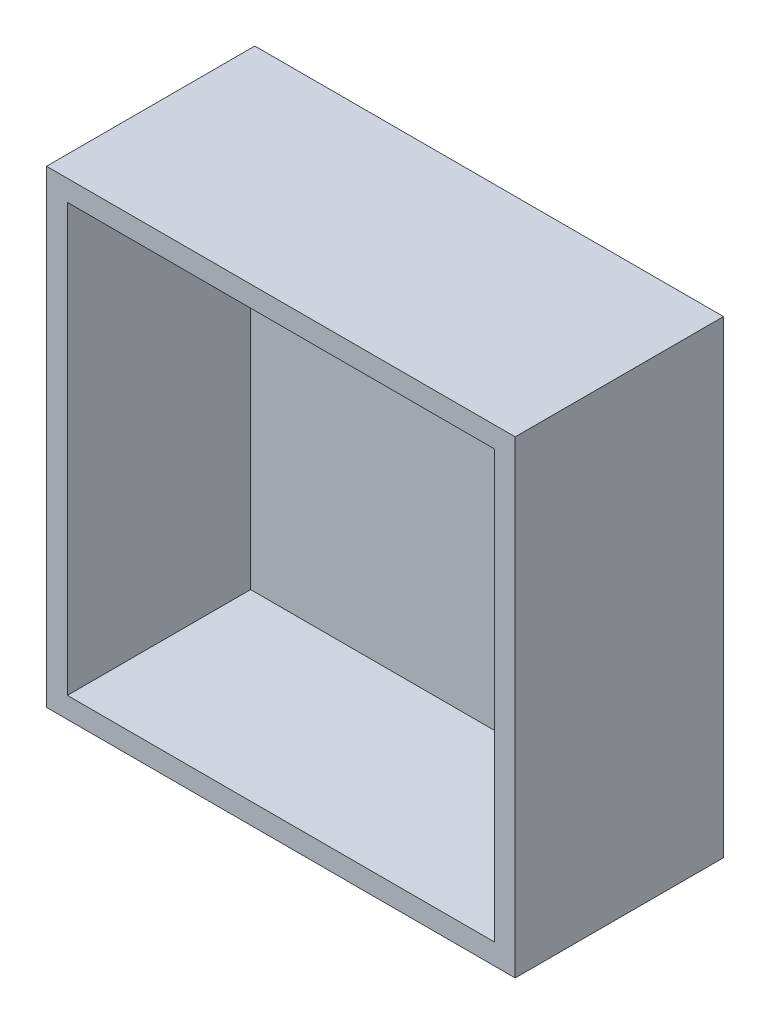
ISO-10303-21;
HEADER;
FILE_DESCRIPTION(('STEP AP214'),'2;1');
FILE_NAME('part.step','',(''),(''),'','','');
FILE_SCHEMA(('AUTOMOTIVE_DESIGN { 1 0 10303 214 1 1 1 1 }'));
ENDSEC;
DATA;
#1=APPLICATION_CONTEXT('core data for automotive mechanical design processes');
#2=APPLICATION_PROTOCOL_DEFINITION('international standard','automotive_design',2000,#1);
#3=PRODUCT_CONTEXT('',#1,'mechanical');
#4=PRODUCT('Part','Part','',(#3));
#5=PRODUCT_RELATED_PRODUCT_CATEGORY('part','',(#4));
#6=PRODUCT_DEFINITION_FORMATION('','',#4);
#7=PRODUCT_DEFINITION_CONTEXT('part definition',#1,'design');
#8=PRODUCT_DEFINITION('design','',#6,#7);
#9=PRODUCT_DEFINITION_SHAPE('','',#8);
#10=(LENGTH_UNIT() NAMED_UNIT(*) SI_UNIT(.MILLI.,.METRE.));
#11=(NAMED_UNIT(*) PLANE_ANGLE_UNIT() SI_UNIT($,.RADIAN.));
#12=(NAMED_UNIT(*) SI_UNIT($,.STERADIAN.) SOLID_ANGLE_UNIT());
#13=UNCERTAINTY_MEASURE_WITH_UNIT(LENGTH_MEASURE(1.E-05),#10,'distance_accuracy_value','');
#14=(GEOMETRIC_REPRESENTATION_CONTEXT(3) GLOBAL_UNCERTAINTY_ASSIGNED_CONTEXT((#13)) GLOBAL_UNIT_ASSIGNED_CONTEXT((#10,
#11,#12)) REPRESENTATION_CONTEXT('',''));
#15=CARTESIAN_POINT('',(0.,0.,0.));
#16=DIRECTION('',(0.,0.,1.));
#17=DIRECTION('',(1.,0.,0.));
#18=AXIS2_PLACEMENT_3D('',#15,#16,#17);
#19=CARTESIAN_POINT('',(22.5,22.5,20.));
#20=DIRECTION('',(-1.,0.,0.));
#21=DIRECTION('',(0.,-1.,0.));
#22=AXIS2_PLACEMENT_3D('',#19,#20,#21);
#23=PLANE('',#22);
#24=DIRECTION('',(0.,1.,0.));
#25=VECTOR('',#24,1.);
#26=CARTESIAN_POINT('',(22.5,22.5,0.));
#27=LINE('',#26,#25);
#28=CARTESIAN_POINT('',(22.5,-22.5,0.));
#29=VERTEX_POINT('',#28);
#30=CARTESIAN_POINT('',(22.5,22.5,0.));
#31=VERTEX_POINT('',#30);
#32=EDGE_CURVE('E139',#29,#31,#27,.T.);
#33=ORIENTED_EDGE('',*,*,#32,.T.);
#34=DIRECTION('',(0.,0.,-1.));
#35=VECTOR('',#34,1.);
#36=CARTESIAN_POINT('',(22.5,22.5,20.));
#37=LINE('',#36,#35);
#38=CARTESIAN_POINT('',(22.5,22.5,20.));
#39=VERTEX_POINT('',#38);
#40=EDGE_CURVE('E11',#39,#31,#37,.T.);
#41=ORIENTED_EDGE('',*,*,#40,.F.);
#42=DIRECTION('',(0.,1.,0.));
#43=VECTOR('',#42,1.);
#44=CARTESIAN_POINT('',(22.5,22.5,20.));
#45=LINE('',#44,#43);
#46=CARTESIAN_POINT('',(22.5,-22.5,20.));
#47=VERTEX_POINT('',#46);
#48=EDGE_CURVE('E150',#47,#39,#45,.T.);
#49=ORIENTED_EDGE('',*,*,#48,.F.);
#50=DIRECTION('',(0.,0.,-1.));
#51=VECTOR('',#50,1.);
#52=CARTESIAN_POINT('',(22.5,-22.5,20.));
#53=LINE('',#52,#51);
#54=EDGE_CURVE('E156',#47,#29,#53,.T.);
#55=ORIENTED_EDGE('',*,*,#54,.T.);
#56=EDGE_LOOP('',(#33,#41,#49,#55));
#57=FACE_BOUND('',#56,.T.);
#58=ADVANCED_FACE('F37',(#57),#23,.F.);
#59=CARTESIAN_POINT('',(-22.5,22.5,20.));
#60=DIRECTION('',(0.,-1.,0.));
#61=DIRECTION('',(0.,0.,-1.));
#62=AXIS2_PLACEMENT_3D('',#59,#60,#61);
#63=PLANE('',#62);
#64=DIRECTION('',(-1.,0.,0.));
#65=VECTOR('',#64,1.);
#66=CARTESIAN_POINT('',(-22.5,22.5,0.));
#67=LINE('',#66,#65);
#68=CARTESIAN_POINT('',(-22.5,22.5,0.));
#69=VERTEX_POINT('',#68);
#70=EDGE_CURVE('E159',#31,#69,#67,.T.);
#71=ORIENTED_EDGE('',*,*,#70,.T.);
#72=DIRECTION('',(0.,0.,-1.));
#73=VECTOR('',#72,1.);
#74=CARTESIAN_POINT('',(-22.5,22.5,20.));
#75=LINE('',#74,#73);
#76=CARTESIAN_POINT('',(-22.5,22.5,20.));
#77=VERTEX_POINT('',#76);
#78=EDGE_CURVE('E44',#77,#69,#75,.T.);
#79=ORIENTED_EDGE('',*,*,#78,.F.);
#80=DIRECTION('',(-1.,0.,0.));
#81=VECTOR('',#80,1.);
#82=CARTESIAN_POINT('',(-22.5,22.5,20.));
#83=LINE('',#82,#81);
#84=EDGE_CURVE('E88',#39,#77,#83,.T.);
#85=ORIENTED_EDGE('',*,*,#84,.F.);
#86=ORIENTED_EDGE('',*,*,#40,.T.);
#87=EDGE_LOOP('',(#71,#79,#85,#86));
#88=FACE_BOUND('',#87,.T.);
#89=ADVANCED_FACE('F186',(#88),#63,.F.);
#90=CARTESIAN_POINT('',(-22.5,22.5,20.));
#91=DIRECTION('',(1.,0.,0.));
#92=DIRECTION('',(0.,1.,0.));
#93=AXIS2_PLACEMENT_3D('',#90,#91,#92);
#94=PLANE('',#93);
#95=DIRECTION('',(0.,-1.,0.));
#96=VECTOR('',#95,1.);
#97=CARTESIAN_POINT('',(-22.5,22.5,0.));
#98=LINE('',#97,#96);
#99=CARTESIAN_POINT('',(-22.5,-22.5,0.));
#100=VERTEX_POINT('',#99);
#101=EDGE_CURVE('E161',#69,#100,#98,.T.);
#102=ORIENTED_EDGE('',*,*,#101,.T.);
#103=DIRECTION('',(0.,0.,-1.));
#104=VECTOR('',#103,1.);
#105=CARTESIAN_POINT('',(-22.5,-22.5,20.));
#106=LINE('',#105,#104);
#107=CARTESIAN_POINT('',(-22.5,-22.5,20.));
#108=VERTEX_POINT('',#107);
#109=EDGE_CURVE('E165',#108,#100,#106,.T.);
#110=ORIENTED_EDGE('',*,*,#109,.F.);
#111=DIRECTION('',(0.,-1.,0.));
#112=VECTOR('',#111,1.);
#113=CARTESIAN_POINT('',(-22.5,22.5,20.));
#114=LINE('',#113,#112);
#115=EDGE_CURVE('E153',#77,#108,#114,.T.);
#116=ORIENTED_EDGE('',*,*,#115,.F.);
#117=ORIENTED_EDGE('',*,*,#78,.T.);
#118=EDGE_LOOP('',(#102,#110,#116,#117));
#119=FACE_BOUND('',#118,.T.);
#120=ADVANCED_FACE('F170',(#119),#94,.F.);
#121=CARTESIAN_POINT('',(-22.5,-22.5,20.));
#122=DIRECTION('',(0.,1.,0.));
#123=DIRECTION('',(0.,0.,1.));
#124=AXIS2_PLACEMENT_3D('',#121,#122,#123);
#125=PLANE('',#124);
#126=DIRECTION('',(1.,0.,0.));
#127=VECTOR('',#126,1.);
#128=CARTESIAN_POINT('',(-22.5,-22.5,0.));
#129=LINE('',#128,#127);
#130=EDGE_CURVE('E81',#100,#29,#129,.T.);
#131=ORIENTED_EDGE('',*,*,#130,.T.);
#132=ORIENTED_EDGE('',*,*,#54,.F.);
#133=DIRECTION('',(1.,0.,0.));
#134=VECTOR('',#133,1.);
#135=CARTESIAN_POINT('',(-22.5,-22.5,20.));
#136=LINE('',#135,#134);
#137=EDGE_CURVE('E60',#108,#47,#136,.T.);
#138=ORIENTED_EDGE('',*,*,#137,.F.);
#139=ORIENTED_EDGE('',*,*,#109,.T.);
#140=EDGE_LOOP('',(#131,#132,#138,#139));
#141=FACE_BOUND('',#140,.T.);
#142=ADVANCED_FACE('F178',(#141),#125,.F.);
#143=CARTESIAN_POINT('',(0.,0.,20.));
#144=DIRECTION('',(0.,0.,1.));
#145=DIRECTION('',(1.,0.,0.));
#146=AXIS2_PLACEMENT_3D('',#143,#144,#145);
#147=PLANE('',#146);
#148=DIRECTION('',(-1.,0.,0.));
#149=VECTOR('',#148,1.);
#150=CARTESIAN_POINT('',(-20.5,20.5,20.));
#151=LINE('',#150,#149);
#152=CARTESIAN_POINT('',(20.5,20.5,20.));
#153=VERTEX_POINT('',#152);
#154=CARTESIAN_POINT('',(-20.5,20.5,20.));
#155=VERTEX_POINT('',#154);
#156=EDGE_CURVE('E51',#153,#155,#151,.T.);
#157=ORIENTED_EDGE('',*,*,#156,.F.);
#158=DIRECTION('',(0.,1.,0.));
#159=VECTOR('',#158,1.);
#160=CARTESIAN_POINT('',(20.5,20.5,20.));
#161=LINE('',#160,#159);
#162=CARTESIAN_POINT('',(20.5,-20.5,20.));
#163=VERTEX_POINT('',#162);
#164=EDGE_CURVE('E131',#163,#153,#161,.T.);
#165=ORIENTED_EDGE('',*,*,#164,.F.);
#166=DIRECTION('',(1.,0.,0.));
#167=VECTOR('',#166,1.);
#168=CARTESIAN_POINT('',(-20.5,-20.5,20.));
#169=LINE('',#168,#167);
#170=CARTESIAN_POINT('',(-20.5,-20.5,20.));
#171=VERTEX_POINT('',#170);
#172=EDGE_CURVE('E114',#171,#163,#169,.T.);
#173=ORIENTED_EDGE('',*,*,#172,.F.);
#174=DIRECTION('',(0.,-1.,0.));
#175=VECTOR('',#174,1.);
#176=CARTESIAN_POINT('',(-20.5,20.5,20.));
#177=LINE('',#176,#175);
#178=EDGE_CURVE('E125',#155,#171,#177,.T.);
#179=ORIENTED_EDGE('',*,*,#178,.F.);
#180=EDGE_LOOP('',(#157,#165,#173,#179));
#181=FACE_BOUND('',#180,.T.);
#182=ORIENTED_EDGE('',*,*,#48,.T.);
#183=ORIENTED_EDGE('',*,*,#84,.T.);
#184=ORIENTED_EDGE('',*,*,#115,.T.);
#185=ORIENTED_EDGE('',*,*,#137,.T.);
#186=EDGE_LOOP('',(#182,#183,#184,#185));
#187=FACE_BOUND('',#186,.T.);
#188=ADVANCED_FACE('F129',(#181,#187),#147,.T.);
#189=CARTESIAN_POINT('',(0.,0.,0.));
#190=DIRECTION('',(0.,0.,1.));
#191=DIRECTION('',(1.,0.,0.));
#192=AXIS2_PLACEMENT_3D('',#189,#190,#191);
#193=PLANE('',#192);
#194=ORIENTED_EDGE('',*,*,#32,.F.);
#195=ORIENTED_EDGE('',*,*,#130,.F.);
#196=ORIENTED_EDGE('',*,*,#101,.F.);
#197=ORIENTED_EDGE('',*,*,#70,.F.);
#198=EDGE_LOOP('',(#194,#195,#196,#197));
#199=FACE_BOUND('',#198,.T.);
#200=ADVANCED_FACE('F174',(#199),#193,.F.);
#201=CARTESIAN_POINT('',(-20.5,20.5,20.));
#202=DIRECTION('',(0.,0.999390827019096,-0.034899496702501));
#203=DIRECTION('',(0.,0.034899496702501,0.999390827019096));
#204=AXIS2_PLACEMENT_3D('',#201,#202,#203);
#205=PLANE('',#204);
#206=ORIENTED_EDGE('',*,*,#156,.T.);
#207=DIRECTION('',(-0.0348782627423747,0.0348782627423747,0.998782765958718));
#208=VECTOR('',#207,1.);
#209=CARTESIAN_POINT('',(-20.5,20.5,20.));
#210=LINE('',#209,#208);
#211=CARTESIAN_POINT('',(-19.9063469186403,19.9063469186403,3.));
#212=VERTEX_POINT('',#211);
#213=EDGE_CURVE('E122',#212,#155,#210,.T.);
#214=ORIENTED_EDGE('',*,*,#213,.F.);
#215=DIRECTION('',(-1.,0.,0.));
#216=VECTOR('',#215,1.);
#217=CARTESIAN_POINT('',(-20.5,19.9063469186403,3.));
#218=LINE('',#217,#216);
#219=CARTESIAN_POINT('',(19.9063469186403,19.9063469186403,3.));
#220=VERTEX_POINT('',#219);
#221=EDGE_CURVE('E133',#220,#212,#218,.T.);
#222=ORIENTED_EDGE('',*,*,#221,.F.);
#223=DIRECTION('',(0.0348782627423747,0.0348782627423747,0.998782765958718));
#224=VECTOR('',#223,1.);
#225=CARTESIAN_POINT('',(20.5,20.5,20.));
#226=LINE('',#225,#224);
#227=EDGE_CURVE('E137',#220,#153,#226,.T.);
#228=ORIENTED_EDGE('',*,*,#227,.T.);
#229=EDGE_LOOP('',(#206,#214,#222,#228));
#230=FACE_BOUND('',#229,.T.);
#231=ADVANCED_FACE('F213',(#230),#205,.F.);
#232=CARTESIAN_POINT('',(20.5,20.5,20.));
#233=DIRECTION('',(0.999390827019096,0.,-0.034899496702501));
#234=DIRECTION('',(-0.0348994967025011,0.,-0.999390827019096));
#235=AXIS2_PLACEMENT_3D('',#232,#233,#234);
#236=PLANE('',#235);
#237=ORIENTED_EDGE('',*,*,#164,.T.);
#238=ORIENTED_EDGE('',*,*,#227,.F.);
#239=DIRECTION('',(0.,1.,0.));
#240=VECTOR('',#239,1.);
#241=CARTESIAN_POINT('',(19.9063469186403,20.5,3.));
#242=LINE('',#241,#240);
#243=CARTESIAN_POINT('',(19.9063469186403,-19.9063469186403,3.));
#244=VERTEX_POINT('',#243);
#245=EDGE_CURVE('E140',#244,#220,#242,.T.);
#246=ORIENTED_EDGE('',*,*,#245,.F.);
#247=DIRECTION('',(0.0348782627423747,-0.0348782627423747,0.998782765958718));
#248=VECTOR('',#247,1.);
#249=CARTESIAN_POINT('',(20.450123778311,-20.450123778311,18.5717318829198));
#250=LINE('',#249,#248);
#251=EDGE_CURVE('E121',#244,#163,#250,.T.);
#252=ORIENTED_EDGE('',*,*,#251,.T.);
#253=EDGE_LOOP('',(#237,#238,#246,#252));
#254=FACE_BOUND('',#253,.T.);
#255=ADVANCED_FACE('F226',(#254),#236,.F.);
#256=CARTESIAN_POINT('',(-20.5,-20.5,20.));
#257=DIRECTION('',(0.,-0.999390827019096,-0.034899496702501));
#258=DIRECTION('',(0.,0.034899496702501,-0.999390827019096));
#259=AXIS2_PLACEMENT_3D('',#256,#257,#258);
#260=PLANE('',#259);
#261=ORIENTED_EDGE('',*,*,#172,.T.);
#262=ORIENTED_EDGE('',*,*,#251,.F.);
#263=DIRECTION('',(1.,0.,0.));
#264=VECTOR('',#263,1.);
#265=CARTESIAN_POINT('',(-20.5,-19.9063469186403,3.));
#266=LINE('',#265,#264);
#267=CARTESIAN_POINT('',(-19.9063469186403,-19.9063469186403,3.));
#268=VERTEX_POINT('',#267);
#269=EDGE_CURVE('E117',#268,#244,#266,.T.);
#270=ORIENTED_EDGE('',*,*,#269,.F.);
#271=DIRECTION('',(-0.0348782627423747,-0.0348782627423747,0.998782765958718));
#272=VECTOR('',#271,1.);
#273=CARTESIAN_POINT('',(-20.450123778311,-20.450123778311,18.5717318829198));
#274=LINE('',#273,#272);
#275=EDGE_CURVE('E110',#268,#171,#274,.T.);
#276=ORIENTED_EDGE('',*,*,#275,.T.);
#277=EDGE_LOOP('',(#261,#262,#270,#276));
#278=FACE_BOUND('',#277,.T.);
#279=ADVANCED_FACE('F112',(#278),#260,.F.);
#280=CARTESIAN_POINT('',(-20.5,20.5,20.));
#281=DIRECTION('',(-0.999390827019096,0.,-0.034899496702501));
#282=DIRECTION('',(-0.0348994967025011,0.,0.999390827019096));
#283=AXIS2_PLACEMENT_3D('',#280,#281,#282);
#284=PLANE('',#283);
#285=ORIENTED_EDGE('',*,*,#178,.T.);
#286=ORIENTED_EDGE('',*,*,#275,.F.);
#287=DIRECTION('',(0.,-1.,0.));
#288=VECTOR('',#287,1.);
#289=CARTESIAN_POINT('',(-19.9063469186403,20.5,3.));
#290=LINE('',#289,#288);
#291=EDGE_CURVE('E145',#212,#268,#290,.T.);
#292=ORIENTED_EDGE('',*,*,#291,.F.);
#293=ORIENTED_EDGE('',*,*,#213,.T.);
#294=EDGE_LOOP('',(#285,#286,#292,#293));
#295=FACE_BOUND('',#294,.T.);
#296=ADVANCED_FACE('F126',(#295),#284,.F.);
#297=CARTESIAN_POINT('',(0.,0.,3.));
#298=DIRECTION('',(0.,0.,-1.));
#299=DIRECTION('',(-1.,0.,0.));
#300=AXIS2_PLACEMENT_3D('',#297,#298,#299);
#301=PLANE('',#300);
#302=ORIENTED_EDGE('',*,*,#221,.T.);
#303=ORIENTED_EDGE('',*,*,#291,.T.);
#304=ORIENTED_EDGE('',*,*,#269,.T.);
#305=ORIENTED_EDGE('',*,*,#245,.T.);
#306=EDGE_LOOP('',(#302,#303,#304,#305));
#307=FACE_BOUND('',#306,.T.);
#308=ADVANCED_FACE('F252',(#307),#301,.F.);
#309=CLOSED_SHELL('',(#58,#89,#120,#142,#188,#200,#231,#255,#279,#296,#308));
#310=MANIFOLD_SOLID_BREP('B2',#309);
#311=ADVANCED_BREP_SHAPE_REPRESENTATION('',(#18,#310),#14);
#312=SHAPE_DEFINITION_REPRESENTATION(#9,#311);
ENDSEC;
END-ISO-10303-21;
